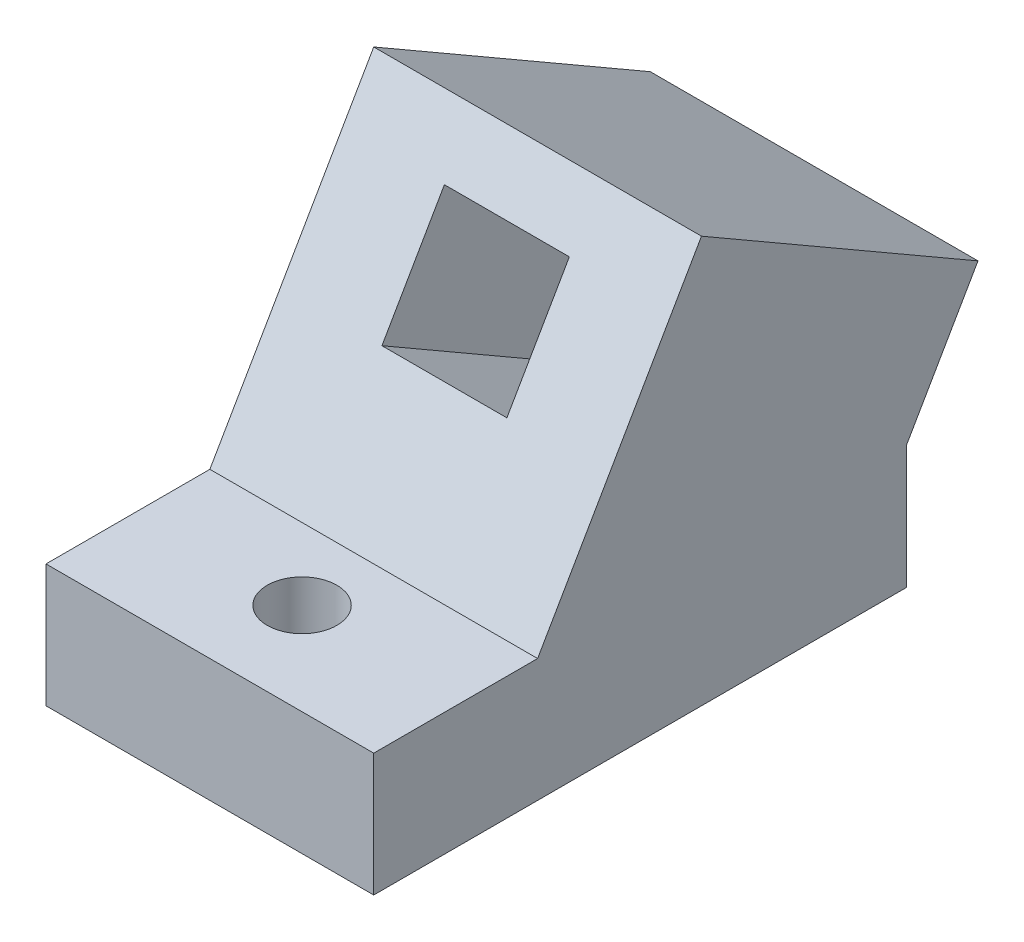
ISO-10303-21;
HEADER;
FILE_DESCRIPTION(('STEP AP214'),'2;1');
FILE_NAME('part.step','',(''),(''),'','','');
FILE_SCHEMA(('AUTOMOTIVE_DESIGN { 1 0 10303 214 1 1 1 1 }'));
ENDSEC;
DATA;
#1=APPLICATION_CONTEXT('core data for automotive mechanical design processes');
#2=APPLICATION_PROTOCOL_DEFINITION('international standard','automotive_design',2000,#1);
#3=PRODUCT_CONTEXT('',#1,'mechanical');
#4=PRODUCT('Part','Part','',(#3));
#5=PRODUCT_RELATED_PRODUCT_CATEGORY('part','',(#4));
#6=PRODUCT_DEFINITION_FORMATION('','',#4);
#7=PRODUCT_DEFINITION_CONTEXT('part definition',#1,'design');
#8=PRODUCT_DEFINITION('design','',#6,#7);
#9=PRODUCT_DEFINITION_SHAPE('','',#8);
#10=(LENGTH_UNIT() NAMED_UNIT(*) SI_UNIT(.MILLI.,.METRE.));
#11=(NAMED_UNIT(*) PLANE_ANGLE_UNIT() SI_UNIT($,.RADIAN.));
#12=(NAMED_UNIT(*) SI_UNIT($,.STERADIAN.) SOLID_ANGLE_UNIT());
#13=UNCERTAINTY_MEASURE_WITH_UNIT(LENGTH_MEASURE(1.E-05),#10,'distance_accuracy_value','');
#14=(GEOMETRIC_REPRESENTATION_CONTEXT(3) GLOBAL_UNCERTAINTY_ASSIGNED_CONTEXT((#13)) GLOBAL_UNIT_ASSIGNED_CONTEXT((#10,
#11,#12)) REPRESENTATION_CONTEXT('',''));
#15=CARTESIAN_POINT('',(0.,0.,0.));
#16=DIRECTION('',(0.,0.,1.));
#17=DIRECTION('',(1.,0.,0.));
#18=AXIS2_PLACEMENT_3D('',#15,#16,#17);
#19=CARTESIAN_POINT('',(0.,3.,0.));
#20=DIRECTION('',(0.,-1.,0.));
#21=DIRECTION('',(0.,0.,-1.));
#22=AXIS2_PLACEMENT_3D('',#19,#20,#21);
#23=PLANE('',#22);
#24=CARTESIAN_POINT('',(4.,3.,-2.25));
#25=DIRECTION('',(0.,1.,0.));
#26=DIRECTION('',(0.,0.,1.));
#27=AXIS2_PLACEMENT_3D('',#24,#25,#26);
#28=CIRCLE('',#27,0.85);
#29=CARTESIAN_POINT('',(4.,3.,-1.4));
#30=VERTEX_POINT('',#29);
#31=EDGE_CURVE('E207',#30,#30,#28,.T.);
#32=ORIENTED_EDGE('',*,*,#31,.F.);
#33=EDGE_LOOP('',(#32));
#34=FACE_BOUND('',#33,.T.);
#35=DIRECTION('',(1.,0.,0.));
#36=VECTOR('',#35,1.);
#37=CARTESIAN_POINT('',(-12.7891555624286,3.,-4.));
#38=LINE('',#37,#36);
#39=CARTESIAN_POINT('',(0.,3.,-4.));
#40=VERTEX_POINT('',#39);
#41=CARTESIAN_POINT('',(8.,3.,-4.));
#42=VERTEX_POINT('',#41);
#43=EDGE_CURVE('E179',#40,#42,#38,.T.);
#44=ORIENTED_EDGE('',*,*,#43,.F.);
#45=DIRECTION('',(0.,0.,1.));
#46=VECTOR('',#45,1.);
#47=CARTESIAN_POINT('',(0.,3.,0.));
#48=LINE('',#47,#46);
#49=CARTESIAN_POINT('',(0.,3.,0.));
#50=VERTEX_POINT('',#49);
#51=EDGE_CURVE('E211',#40,#50,#48,.T.);
#52=ORIENTED_EDGE('',*,*,#51,.T.);
#53=DIRECTION('',(1.,0.,0.));
#54=VECTOR('',#53,1.);
#55=CARTESIAN_POINT('',(0.,3.,0.));
#56=LINE('',#55,#54);
#57=CARTESIAN_POINT('',(8.,3.,0.));
#58=VERTEX_POINT('',#57);
#59=EDGE_CURVE('E213',#50,#58,#56,.T.);
#60=ORIENTED_EDGE('',*,*,#59,.T.);
#61=DIRECTION('',(0.,0.,-1.));
#62=VECTOR('',#61,1.);
#63=CARTESIAN_POINT('',(8.,3.,0.));
#64=LINE('',#63,#62);
#65=EDGE_CURVE('E220',#58,#42,#64,.T.);
#66=ORIENTED_EDGE('',*,*,#65,.T.);
#67=EDGE_LOOP('',(#44,#52,#60,#66));
#68=FACE_BOUND('',#67,.T.);
#69=ADVANCED_FACE('F39',(#34,#68),#23,.F.);
#70=CARTESIAN_POINT('',(0.,0.,0.));
#71=DIRECTION('',(0.,-1.,0.));
#72=DIRECTION('',(0.,0.,-1.));
#73=AXIS2_PLACEMENT_3D('',#70,#71,#72);
#74=PLANE('',#73);
#75=CARTESIAN_POINT('',(4.,0.,-2.25));
#76=DIRECTION('',(0.,1.,0.));
#77=DIRECTION('',(0.,0.,1.));
#78=AXIS2_PLACEMENT_3D('',#75,#76,#77);
#79=CIRCLE('',#78,0.85);
#80=CARTESIAN_POINT('',(4.,0.,-1.4));
#81=VERTEX_POINT('',#80);
#82=EDGE_CURVE('E204',#81,#81,#79,.T.);
#83=ORIENTED_EDGE('',*,*,#82,.T.);
#84=EDGE_LOOP('',(#83));
#85=FACE_BOUND('',#84,.T.);
#86=DIRECTION('',(0.,0.,1.));
#87=VECTOR('',#86,1.);
#88=CARTESIAN_POINT('',(0.,0.,0.));
#89=LINE('',#88,#87);
#90=CARTESIAN_POINT('',(0.,0.,-13.));
#91=VERTEX_POINT('',#90);
#92=CARTESIAN_POINT('',(0.,0.,0.));
#93=VERTEX_POINT('',#92);
#94=EDGE_CURVE('E209',#91,#93,#89,.T.);
#95=ORIENTED_EDGE('',*,*,#94,.F.);
#96=DIRECTION('',(-1.,0.,0.));
#97=VECTOR('',#96,1.);
#98=CARTESIAN_POINT('',(0.,0.,-13.));
#99=LINE('',#98,#97);
#100=CARTESIAN_POINT('',(8.,0.,-13.));
#101=VERTEX_POINT('',#100);
#102=EDGE_CURVE('E212',#101,#91,#99,.T.);
#103=ORIENTED_EDGE('',*,*,#102,.F.);
#104=DIRECTION('',(0.,0.,-1.));
#105=VECTOR('',#104,1.);
#106=CARTESIAN_POINT('',(8.,0.,0.));
#107=LINE('',#106,#105);
#108=CARTESIAN_POINT('',(8.,0.,0.));
#109=VERTEX_POINT('',#108);
#110=EDGE_CURVE('E226',#109,#101,#107,.T.);
#111=ORIENTED_EDGE('',*,*,#110,.F.);
#112=DIRECTION('',(1.,0.,0.));
#113=VECTOR('',#112,1.);
#114=CARTESIAN_POINT('',(0.,0.,0.));
#115=LINE('',#114,#113);
#116=EDGE_CURVE('E228',#93,#109,#115,.T.);
#117=ORIENTED_EDGE('',*,*,#116,.F.);
#118=EDGE_LOOP('',(#95,#103,#111,#117));
#119=FACE_BOUND('',#118,.T.);
#120=CARTESIAN_POINT('',(4.,0.,-10.75));
#121=DIRECTION('',(0.,1.,0.));
#122=DIRECTION('',(0.,0.,-1.));
#123=AXIS2_PLACEMENT_3D('',#120,#121,#122);
#124=CIRCLE('',#123,0.85);
#125=CARTESIAN_POINT('',(4.,0.,-11.6));
#126=VERTEX_POINT('',#125);
#127=EDGE_CURVE('E205',#126,#126,#124,.T.);
#128=ORIENTED_EDGE('',*,*,#127,.T.);
#129=EDGE_LOOP('',(#128));
#130=FACE_BOUND('',#129,.T.);
#131=ADVANCED_FACE('F249',(#85,#119,#130),#74,.T.);
#132=CARTESIAN_POINT('',(0.,3.,0.));
#133=DIRECTION('',(1.,0.,0.));
#134=DIRECTION('',(0.,0.,-1.));
#135=AXIS2_PLACEMENT_3D('',#132,#133,#134);
#136=PLANE('',#135);
#137=ORIENTED_EDGE('',*,*,#94,.T.);
#138=DIRECTION('',(0.,-1.,0.));
#139=VECTOR('',#138,1.);
#140=CARTESIAN_POINT('',(0.,3.,0.));
#141=LINE('',#140,#139);
#142=EDGE_CURVE('E50',#50,#93,#141,.T.);
#143=ORIENTED_EDGE('',*,*,#142,.F.);
#144=ORIENTED_EDGE('',*,*,#51,.F.);
#145=DIRECTION('',(0.,0.866025403784436,-0.500000000000004));
#146=VECTOR('',#145,1.);
#147=CARTESIAN_POINT('',(0.,9.92820323027549,-8.00000000000003));
#148=LINE('',#147,#146);
#149=CARTESIAN_POINT('',(0.,9.92820323027549,-8.00000000000003));
#150=VERTEX_POINT('',#149);
#151=EDGE_CURVE('E177',#40,#150,#148,.T.);
#152=ORIENTED_EDGE('',*,*,#151,.T.);
#153=DIRECTION('',(0.,-0.500000000000004,-0.866025403784436));
#154=VECTOR('',#153,1.);
#155=CARTESIAN_POINT('',(0.,6.0310889132455,-14.75));
#156=LINE('',#155,#154);
#157=CARTESIAN_POINT('',(0.,6.0310889132455,-14.75));
#158=VERTEX_POINT('',#157);
#159=EDGE_CURVE('E180',#150,#158,#156,.T.);
#160=ORIENTED_EDGE('',*,*,#159,.T.);
#161=DIRECTION('',(0.,-0.866025403784436,0.500000000000004));
#162=VECTOR('',#161,1.);
#163=CARTESIAN_POINT('',(0.,3.,-13.));
#164=LINE('',#163,#162);
#165=CARTESIAN_POINT('',(0.,3.,-13.));
#166=VERTEX_POINT('',#165);
#167=EDGE_CURVE('E185',#158,#166,#164,.T.);
#168=ORIENTED_EDGE('',*,*,#167,.T.);
#169=DIRECTION('',(0.,-1.,0.));
#170=VECTOR('',#169,1.);
#171=CARTESIAN_POINT('',(0.,3.,-13.));
#172=LINE('',#171,#170);
#173=EDGE_CURVE('E221',#166,#91,#172,.T.);
#174=ORIENTED_EDGE('',*,*,#173,.T.);
#175=EDGE_LOOP('',(#137,#143,#144,#152,#160,#168,#174));
#176=FACE_BOUND('',#175,.T.);
#177=ADVANCED_FACE('F41',(#176),#136,.F.);
#178=CARTESIAN_POINT('',(0.,3.,0.));
#179=DIRECTION('',(0.,0.,-1.));
#180=DIRECTION('',(-1.,0.,0.));
#181=AXIS2_PLACEMENT_3D('',#178,#179,#180);
#182=PLANE('',#181);
#183=ORIENTED_EDGE('',*,*,#116,.T.);
#184=DIRECTION('',(0.,-1.,0.));
#185=VECTOR('',#184,1.);
#186=CARTESIAN_POINT('',(8.,3.,0.));
#187=LINE('',#186,#185);
#188=EDGE_CURVE('E236',#58,#109,#187,.T.);
#189=ORIENTED_EDGE('',*,*,#188,.F.);
#190=ORIENTED_EDGE('',*,*,#59,.F.);
#191=ORIENTED_EDGE('',*,*,#142,.T.);
#192=EDGE_LOOP('',(#183,#189,#190,#191));
#193=FACE_BOUND('',#192,.T.);
#194=ADVANCED_FACE('F245',(#193),#182,.F.);
#195=CARTESIAN_POINT('',(8.,3.,0.));
#196=DIRECTION('',(-1.,0.,0.));
#197=DIRECTION('',(0.,0.,1.));
#198=AXIS2_PLACEMENT_3D('',#195,#196,#197);
#199=PLANE('',#198);
#200=ORIENTED_EDGE('',*,*,#110,.T.);
#201=DIRECTION('',(0.,-1.,0.));
#202=VECTOR('',#201,1.);
#203=CARTESIAN_POINT('',(8.,3.,-13.));
#204=LINE('',#203,#202);
#205=CARTESIAN_POINT('',(8.,3.,-13.));
#206=VERTEX_POINT('',#205);
#207=EDGE_CURVE('E231',#206,#101,#204,.T.);
#208=ORIENTED_EDGE('',*,*,#207,.F.);
#209=DIRECTION('',(0.,0.866025403784436,-0.500000000000004));
#210=VECTOR('',#209,1.);
#211=CARTESIAN_POINT('',(8.,3.,-13.));
#212=LINE('',#211,#210);
#213=CARTESIAN_POINT('',(8.,6.0310889132455,-14.75));
#214=VERTEX_POINT('',#213);
#215=EDGE_CURVE('E176',#206,#214,#212,.T.);
#216=ORIENTED_EDGE('',*,*,#215,.T.);
#217=DIRECTION('',(0.,0.500000000000004,0.866025403784436));
#218=VECTOR('',#217,1.);
#219=CARTESIAN_POINT('',(8.,6.0310889132455,-14.75));
#220=LINE('',#219,#218);
#221=CARTESIAN_POINT('',(8.,9.92820323027549,-8.00000000000003));
#222=VERTEX_POINT('',#221);
#223=EDGE_CURVE('E184',#214,#222,#220,.T.);
#224=ORIENTED_EDGE('',*,*,#223,.T.);
#225=DIRECTION('',(0.,-0.866025403784436,0.500000000000004));
#226=VECTOR('',#225,1.);
#227=CARTESIAN_POINT('',(8.,9.92820323027549,-8.00000000000003));
#228=LINE('',#227,#226);
#229=EDGE_CURVE('E189',#222,#42,#228,.T.);
#230=ORIENTED_EDGE('',*,*,#229,.T.);
#231=ORIENTED_EDGE('',*,*,#65,.F.);
#232=ORIENTED_EDGE('',*,*,#188,.T.);
#233=EDGE_LOOP('',(#200,#208,#216,#224,#230,#231,#232));
#234=FACE_BOUND('',#233,.T.);
#235=ADVANCED_FACE('F251',(#234),#199,.F.);
#236=CARTESIAN_POINT('',(0.,3.,-13.));
#237=DIRECTION('',(0.,0.,1.));
#238=DIRECTION('',(1.,0.,0.));
#239=AXIS2_PLACEMENT_3D('',#236,#237,#238);
#240=PLANE('',#239);
#241=DIRECTION('',(-1.,0.,0.));
#242=VECTOR('',#241,1.);
#243=CARTESIAN_POINT('',(0.,3.,-13.));
#244=LINE('',#243,#242);
#245=CARTESIAN_POINT('',(2.475,3.,-13.));
#246=VERTEX_POINT('',#245);
#247=EDGE_CURVE('E217',#246,#166,#244,.T.);
#248=ORIENTED_EDGE('',*,*,#247,.F.);
#249=DIRECTION('',(0.,-1.,0.));
#250=VECTOR('',#249,1.);
#251=CARTESIAN_POINT('',(2.475,3.,-13.));
#252=LINE('',#251,#250);
#253=CARTESIAN_POINT('',(2.475,1.78756443470175,-13.));
#254=VERTEX_POINT('',#253);
#255=EDGE_CURVE('E173',#246,#254,#252,.T.);
#256=ORIENTED_EDGE('',*,*,#255,.T.);
#257=DIRECTION('',(1.,0.,0.));
#258=VECTOR('',#257,1.);
#259=CARTESIAN_POINT('',(0.,1.78756443470174,-13.));
#260=LINE('',#259,#258);
#261=CARTESIAN_POINT('',(5.525,1.78756443470175,-13.));
#262=VERTEX_POINT('',#261);
#263=EDGE_CURVE('E161',#254,#262,#260,.T.);
#264=ORIENTED_EDGE('',*,*,#263,.T.);
#265=DIRECTION('',(0.,-1.,0.));
#266=VECTOR('',#265,1.);
#267=CARTESIAN_POINT('',(5.525,3.,-13.));
#268=LINE('',#267,#266);
#269=CARTESIAN_POINT('',(5.525,3.,-13.));
#270=VERTEX_POINT('',#269);
#271=EDGE_CURVE('E166',#270,#262,#268,.T.);
#272=ORIENTED_EDGE('',*,*,#271,.F.);
#273=EDGE_CURVE('E219',#206,#270,#244,.T.);
#274=ORIENTED_EDGE('',*,*,#273,.F.);
#275=ORIENTED_EDGE('',*,*,#207,.T.);
#276=ORIENTED_EDGE('',*,*,#102,.T.);
#277=ORIENTED_EDGE('',*,*,#173,.F.);
#278=EDGE_LOOP('',(#248,#256,#264,#272,#274,#275,#276,#277));
#279=FACE_BOUND('',#278,.T.);
#280=ADVANCED_FACE('F258',(#279),#240,.F.);
#281=CARTESIAN_POINT('',(4.,3.,-2.25));
#282=DIRECTION('',(0.,-1.,0.));
#283=DIRECTION('',(0.,0.,-1.));
#284=AXIS2_PLACEMENT_3D('',#281,#282,#283);
#285=CYLINDRICAL_SURFACE('',#284,0.85);
#286=ORIENTED_EDGE('',*,*,#31,.T.);
#287=EDGE_LOOP('',(#286));
#288=FACE_BOUND('',#287,.T.);
#289=ORIENTED_EDGE('',*,*,#82,.F.);
#290=EDGE_LOOP('',(#289));
#291=FACE_BOUND('',#290,.T.);
#292=ADVANCED_FACE('F301',(#288,#291),#285,.F.);
#293=CARTESIAN_POINT('',(4.,3.,-10.75));
#294=DIRECTION('',(0.,-1.,0.));
#295=DIRECTION('',(0.,0.,-1.));
#296=AXIS2_PLACEMENT_3D('',#293,#294,#295);
#297=CYLINDRICAL_SURFACE('',#296,0.85);
#298=CARTESIAN_POINT('',(4.,3.08660254037842,-10.75));
#299=DIRECTION('',(0.,-0.866025403784436,0.500000000000004));
#300=DIRECTION('',(0.,-0.500000000000004,-0.866025403784436));
#301=AXIS2_PLACEMENT_3D('',#298,#299,#300);
#302=ELLIPSE('',#301,0.981495457622366,0.85);
#303=CARTESIAN_POINT('',(3.16333997346592,3.,-10.9));
#304=VERTEX_POINT('',#303);
#305=CARTESIAN_POINT('',(4.83666002653408,3.,-10.9));
#306=VERTEX_POINT('',#305);
#307=EDGE_CURVE('E157',#304,#306,#302,.T.);
#308=ORIENTED_EDGE('',*,*,#307,.F.);
#309=CARTESIAN_POINT('',(4.,3.,-10.75));
#310=DIRECTION('',(0.,1.,0.));
#311=DIRECTION('',(0.,0.,-1.));
#312=AXIS2_PLACEMENT_3D('',#309,#310,#311);
#313=CIRCLE('',#312,0.85);
#314=EDGE_CURVE('E197',#304,#306,#313,.T.);
#315=ORIENTED_EDGE('',*,*,#314,.T.);
#316=EDGE_LOOP('',(#308,#315));
#317=FACE_BOUND('',#316,.T.);
#318=ORIENTED_EDGE('',*,*,#127,.F.);
#319=EDGE_LOOP('',(#318));
#320=FACE_BOUND('',#319,.T.);
#321=ADVANCED_FACE('F340',(#317,#320),#297,.F.);
#322=CARTESIAN_POINT('',(-12.7891555624286,3.,-13.));
#323=DIRECTION('',(0.,-0.500000000000004,-0.866025403784436));
#324=DIRECTION('',(0.,0.866025403784436,-0.500000000000004));
#325=AXIS2_PLACEMENT_3D('',#322,#323,#324);
#326=PLANE('',#325);
#327=DIRECTION('',(0.,0.866025403784436,-0.500000000000004));
#328=VECTOR('',#327,1.);
#329=CARTESIAN_POINT('',(2.475,3.,-13.));
#330=LINE('',#329,#328);
#331=CARTESIAN_POINT('',(2.475,4.73205080756884,-14.));
#332=VERTEX_POINT('',#331);
#333=EDGE_CURVE('E171',#246,#332,#330,.T.);
#334=ORIENTED_EDGE('',*,*,#333,.F.);
#335=ORIENTED_EDGE('',*,*,#247,.T.);
#336=ORIENTED_EDGE('',*,*,#167,.F.);
#337=DIRECTION('',(1.,0.,0.));
#338=VECTOR('',#337,1.);
#339=CARTESIAN_POINT('',(-12.7891555624286,6.0310889132455,-14.75));
#340=LINE('',#339,#338);
#341=EDGE_CURVE('E194',#158,#214,#340,.T.);
#342=ORIENTED_EDGE('',*,*,#341,.T.);
#343=ORIENTED_EDGE('',*,*,#215,.F.);
#344=ORIENTED_EDGE('',*,*,#273,.T.);
#345=DIRECTION('',(0.,0.866025403784436,-0.500000000000004));
#346=VECTOR('',#345,1.);
#347=CARTESIAN_POINT('',(5.525,3.,-13.));
#348=LINE('',#347,#346);
#349=CARTESIAN_POINT('',(5.525,4.73205080756884,-14.));
#350=VERTEX_POINT('',#349);
#351=EDGE_CURVE('E168',#270,#350,#348,.T.);
#352=ORIENTED_EDGE('',*,*,#351,.T.);
#353=DIRECTION('',(-1.,0.,0.));
#354=VECTOR('',#353,1.);
#355=CARTESIAN_POINT('',(-12.7891555624286,4.73205080756885,-14.));
#356=LINE('',#355,#354);
#357=EDGE_CURVE('E137',#350,#332,#356,.T.);
#358=ORIENTED_EDGE('',*,*,#357,.T.);
#359=EDGE_LOOP('',(#334,#335,#336,#342,#343,#344,#352,#358));
#360=FACE_BOUND('',#359,.T.);
#361=ADVANCED_FACE('F262',(#360),#326,.T.);
#362=CARTESIAN_POINT('',(-12.7891555624286,6.0310889132455,-14.75));
#363=DIRECTION('',(0.,0.866025403784436,-0.500000000000004));
#364=DIRECTION('',(0.,0.500000000000004,0.866025403784436));
#365=AXIS2_PLACEMENT_3D('',#362,#363,#364);
#366=PLANE('',#365);
#367=ORIENTED_EDGE('',*,*,#159,.F.);
#368=DIRECTION('',(1.,0.,0.));
#369=VECTOR('',#368,1.);
#370=CARTESIAN_POINT('',(-12.7891555624286,9.92820323027549,-8.00000000000003));
#371=LINE('',#370,#369);
#372=EDGE_CURVE('E193',#150,#222,#371,.T.);
#373=ORIENTED_EDGE('',*,*,#372,.T.);
#374=ORIENTED_EDGE('',*,*,#223,.F.);
#375=ORIENTED_EDGE('',*,*,#341,.F.);
#376=EDGE_LOOP('',(#367,#373,#374,#375));
#377=FACE_BOUND('',#376,.T.);
#378=ADVANCED_FACE('F274',(#377),#366,.T.);
#379=CARTESIAN_POINT('',(-12.7891555624286,9.92820323027549,-8.00000000000003));
#380=DIRECTION('',(0.,0.500000000000004,0.866025403784436));
#381=DIRECTION('',(0.,-0.866025403784436,0.500000000000004));
#382=AXIS2_PLACEMENT_3D('',#379,#380,#381);
#383=PLANE('',#382);
#384=DIRECTION('',(1.,0.,0.));
#385=VECTOR('',#384,1.);
#386=CARTESIAN_POINT('',(2.475,5.98778764305631,-5.72500000000001));
#387=LINE('',#386,#385);
#388=CARTESIAN_POINT('',(2.475,5.98778764305631,-5.72500000000001));
#389=VERTEX_POINT('',#388);
#390=CARTESIAN_POINT('',(5.525,5.98778764305631,-5.72500000000001));
#391=VERTEX_POINT('',#390);
#392=EDGE_CURVE('E61',#389,#391,#387,.T.);
#393=ORIENTED_EDGE('',*,*,#392,.F.);
#394=DIRECTION('',(0.,-0.866025403784436,0.500000000000004));
#395=VECTOR('',#394,1.);
#396=CARTESIAN_POINT('',(2.475,8.62916512459884,-7.25000000000003));
#397=LINE('',#396,#395);
#398=CARTESIAN_POINT('',(2.475,8.62916512459884,-7.25000000000003));
#399=VERTEX_POINT('',#398);
#400=EDGE_CURVE('E155',#399,#389,#397,.T.);
#401=ORIENTED_EDGE('',*,*,#400,.F.);
#402=DIRECTION('',(1.,0.,0.));
#403=VECTOR('',#402,1.);
#404=CARTESIAN_POINT('',(2.475,8.62916512459884,-7.25000000000003));
#405=LINE('',#404,#403);
#406=CARTESIAN_POINT('',(5.525,8.62916512459884,-7.25000000000003));
#407=VERTEX_POINT('',#406);
#408=EDGE_CURVE('E138',#399,#407,#405,.T.);
#409=ORIENTED_EDGE('',*,*,#408,.T.);
#410=DIRECTION('',(0.,-0.866025403784436,0.500000000000004));
#411=VECTOR('',#410,1.);
#412=CARTESIAN_POINT('',(5.525,8.62916512459884,-7.25000000000003));
#413=LINE('',#412,#411);
#414=EDGE_CURVE('E143',#407,#391,#413,.T.);
#415=ORIENTED_EDGE('',*,*,#414,.T.);
#416=EDGE_LOOP('',(#393,#401,#409,#415));
#417=FACE_BOUND('',#416,.T.);
#418=ORIENTED_EDGE('',*,*,#151,.F.);
#419=ORIENTED_EDGE('',*,*,#43,.T.);
#420=ORIENTED_EDGE('',*,*,#229,.F.);
#421=ORIENTED_EDGE('',*,*,#372,.F.);
#422=EDGE_LOOP('',(#418,#419,#420,#421));
#423=FACE_BOUND('',#422,.T.);
#424=ADVANCED_FACE('F148',(#417,#423),#383,.T.);
#425=CARTESIAN_POINT('',(-12.7891555624286,3.,-13.));
#426=DIRECTION('',(0.,-1.,0.));
#427=DIRECTION('',(0.,0.,-1.));
#428=AXIS2_PLACEMENT_3D('',#425,#426,#427);
#429=PLANE('',#428);
#430=DIRECTION('',(-1.,0.,0.));
#431=VECTOR('',#430,1.);
#432=CARTESIAN_POINT('',(-12.7891555624286,3.,-10.8999999999999));
#433=LINE('',#432,#431);
#434=EDGE_CURVE('E11',#306,#304,#433,.T.);
#435=ORIENTED_EDGE('',*,*,#434,.F.);
#436=ORIENTED_EDGE('',*,*,#314,.F.);
#437=EDGE_LOOP('',(#435,#436));
#438=FACE_BOUND('',#437,.T.);
#439=ADVANCED_FACE('F351',(#438),#429,.T.);
#440=CARTESIAN_POINT('',(2.475,3.22427857925745,-16.6115381056766));
#441=DIRECTION('',(-1.,0.,0.));
#442=DIRECTION('',(0.,-1.,0.));
#443=AXIS2_PLACEMENT_3D('',#440,#441,#442);
#444=PLANE('',#443);
#445=ORIENTED_EDGE('',*,*,#333,.T.);
#446=DIRECTION('',(0.,0.500000000000004,0.866025403784436));
#447=VECTOR('',#446,1.);
#448=CARTESIAN_POINT('',(2.475,3.22427857925745,-16.6115381056766));
#449=LINE('',#448,#447);
#450=EDGE_CURVE('E142',#332,#399,#449,.T.);
#451=ORIENTED_EDGE('',*,*,#450,.T.);
#452=ORIENTED_EDGE('',*,*,#400,.T.);
#453=DIRECTION('',(0.,0.500000000000004,0.866025403784436));
#454=VECTOR('',#453,1.);
#455=CARTESIAN_POINT('',(2.475,0.582901097714915,-15.0865381056766));
#456=LINE('',#455,#454);
#457=EDGE_CURVE('E160',#254,#389,#456,.T.);
#458=ORIENTED_EDGE('',*,*,#457,.F.);
#459=ORIENTED_EDGE('',*,*,#255,.F.);
#460=EDGE_LOOP('',(#445,#451,#452,#458,#459));
#461=FACE_BOUND('',#460,.T.);
#462=ADVANCED_FACE('F276',(#461),#444,.F.);
#463=CARTESIAN_POINT('',(5.525,3.22427857925745,-16.6115381056766));
#464=DIRECTION('',(-1.,0.,0.));
#465=DIRECTION('',(0.,0.,1.));
#466=AXIS2_PLACEMENT_3D('',#463,#464,#465);
#467=PLANE('',#466);
#468=ORIENTED_EDGE('',*,*,#271,.T.);
#469=DIRECTION('',(0.,0.500000000000004,0.866025403784436));
#470=VECTOR('',#469,1.);
#471=CARTESIAN_POINT('',(5.525,0.582901097714916,-15.0865381056766));
#472=LINE('',#471,#470);
#473=EDGE_CURVE('E145',#262,#391,#472,.T.);
#474=ORIENTED_EDGE('',*,*,#473,.T.);
#475=ORIENTED_EDGE('',*,*,#414,.F.);
#476=DIRECTION('',(0.,0.500000000000004,0.866025403784436));
#477=VECTOR('',#476,1.);
#478=CARTESIAN_POINT('',(5.525,3.22427857925745,-16.6115381056766));
#479=LINE('',#478,#477);
#480=EDGE_CURVE('E53',#350,#407,#479,.T.);
#481=ORIENTED_EDGE('',*,*,#480,.F.);
#482=ORIENTED_EDGE('',*,*,#351,.F.);
#483=EDGE_LOOP('',(#468,#474,#475,#481,#482));
#484=FACE_BOUND('',#483,.T.);
#485=ADVANCED_FACE('F149',(#484),#467,.T.);
#486=CARTESIAN_POINT('',(2.475,0.582901097714915,-15.0865381056766));
#487=DIRECTION('',(0.,-0.866025403784436,0.500000000000004));
#488=DIRECTION('',(0.,-0.500000000000004,-0.866025403784436));
#489=AXIS2_PLACEMENT_3D('',#486,#487,#488);
#490=PLANE('',#489);
#491=ORIENTED_EDGE('',*,*,#307,.T.);
#492=ORIENTED_EDGE('',*,*,#434,.T.);
#493=EDGE_LOOP('',(#491,#492));
#494=FACE_BOUND('',#493,.T.);
#495=ORIENTED_EDGE('',*,*,#457,.T.);
#496=ORIENTED_EDGE('',*,*,#392,.T.);
#497=ORIENTED_EDGE('',*,*,#473,.F.);
#498=ORIENTED_EDGE('',*,*,#263,.F.);
#499=EDGE_LOOP('',(#495,#496,#497,#498));
#500=FACE_BOUND('',#499,.T.);
#501=ADVANCED_FACE('F280',(#494,#500),#490,.F.);
#502=CARTESIAN_POINT('',(2.475,3.22427857925745,-16.6115381056766));
#503=DIRECTION('',(0.,-0.866025403784436,0.500000000000004));
#504=DIRECTION('',(0.,-0.500000000000004,-0.866025403784436));
#505=AXIS2_PLACEMENT_3D('',#502,#503,#504);
#506=PLANE('',#505);
#507=ORIENTED_EDGE('',*,*,#480,.T.);
#508=ORIENTED_EDGE('',*,*,#408,.F.);
#509=ORIENTED_EDGE('',*,*,#450,.F.);
#510=ORIENTED_EDGE('',*,*,#357,.F.);
#511=EDGE_LOOP('',(#507,#508,#509,#510));
#512=FACE_BOUND('',#511,.T.);
#513=ADVANCED_FACE('F133',(#512),#506,.T.);
#514=CLOSED_SHELL('',(#69,#131,#177,#194,#235,#280,#292,#321,#361,#378,#424,#439,#462,#485,#501,#513));
#515=MANIFOLD_SOLID_BREP('B2',#514);
#516=ADVANCED_BREP_SHAPE_REPRESENTATION('',(#18,#515),#14);
#517=SHAPE_DEFINITION_REPRESENTATION(#9,#516);
ENDSEC;
END-ISO-10303-21;
